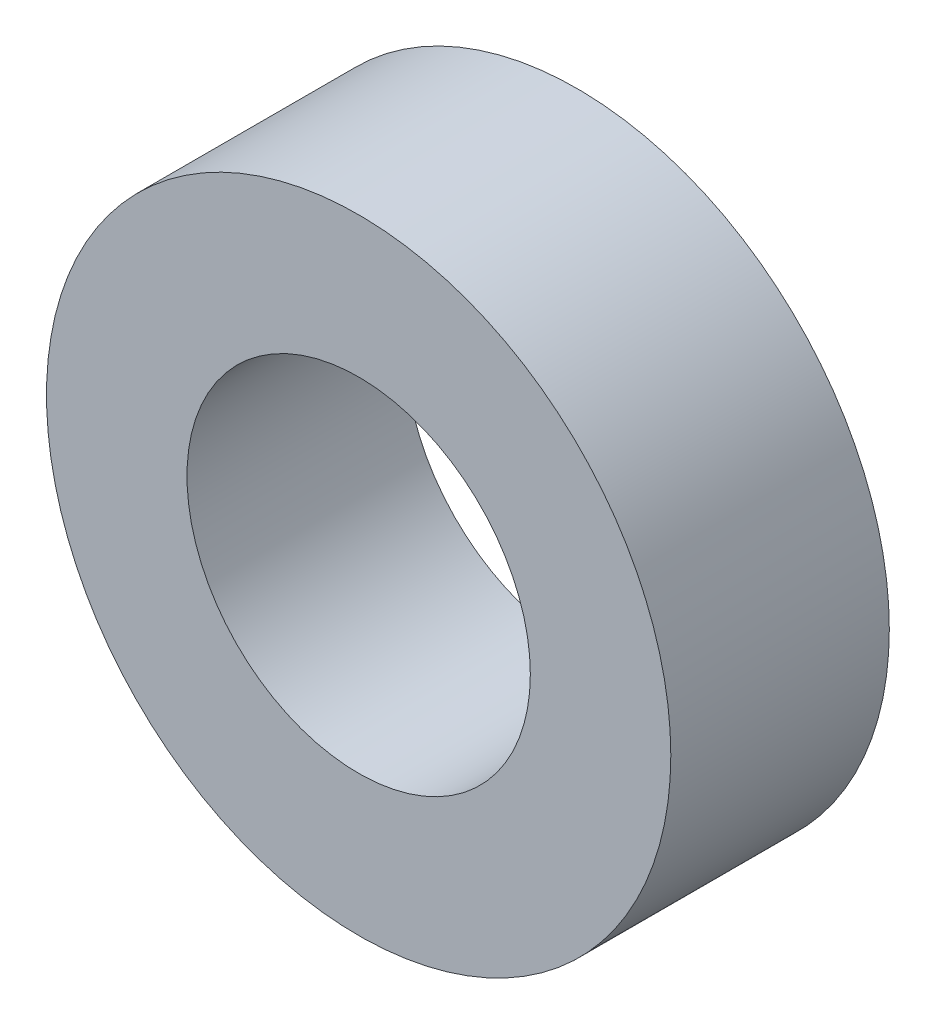
ISO-10303-21;
HEADER;
FILE_DESCRIPTION(('STEP AP214'),'2;1');
FILE_NAME('part.step','',(''),(''),'','','');
FILE_SCHEMA(('AUTOMOTIVE_DESIGN { 1 0 10303 214 1 1 1 1 }'));
ENDSEC;
DATA;
#1=APPLICATION_CONTEXT('core data for automotive mechanical design processes');
#2=APPLICATION_PROTOCOL_DEFINITION('international standard','automotive_design',2000,#1);
#3=PRODUCT_CONTEXT('',#1,'mechanical');
#4=PRODUCT('Part','Part','',(#3));
#5=PRODUCT_RELATED_PRODUCT_CATEGORY('part','',(#4));
#6=PRODUCT_DEFINITION_FORMATION('','',#4);
#7=PRODUCT_DEFINITION_CONTEXT('part definition',#1,'design');
#8=PRODUCT_DEFINITION('design','',#6,#7);
#9=PRODUCT_DEFINITION_SHAPE('','',#8);
#10=(LENGTH_UNIT() NAMED_UNIT(*) SI_UNIT(.MILLI.,.METRE.));
#11=(NAMED_UNIT(*) PLANE_ANGLE_UNIT() SI_UNIT($,.RADIAN.));
#12=(NAMED_UNIT(*) SI_UNIT($,.STERADIAN.) SOLID_ANGLE_UNIT());
#13=UNCERTAINTY_MEASURE_WITH_UNIT(LENGTH_MEASURE(1.E-05),#10,'distance_accuracy_value','');
#14=(GEOMETRIC_REPRESENTATION_CONTEXT(3) GLOBAL_UNCERTAINTY_ASSIGNED_CONTEXT((#13)) GLOBAL_UNIT_ASSIGNED_CONTEXT((#10,
#11,#12)) REPRESENTATION_CONTEXT('',''));
#15=CARTESIAN_POINT('',(0.,0.,0.));
#16=DIRECTION('',(0.,0.,1.));
#17=DIRECTION('',(1.,0.,0.));
#18=AXIS2_PLACEMENT_3D('',#15,#16,#17);
#19=CARTESIAN_POINT('',(0.,0.,17.5));
#20=DIRECTION('',(0.,0.,1.));
#21=DIRECTION('',(1.,0.,0.));
#22=AXIS2_PLACEMENT_3D('',#19,#20,#21);
#23=PLANE('',#22);
#24=CARTESIAN_POINT('',(0.,0.,17.5));
#25=DIRECTION('',(0.,0.,1.));
#26=DIRECTION('',(1.,0.,0.));
#27=AXIS2_PLACEMENT_3D('',#24,#25,#26);
#28=CIRCLE('',#27,50.);
#29=CARTESIAN_POINT('',(50.,0.,17.5));
#30=VERTEX_POINT('',#29);
#31=EDGE_CURVE('E10',#30,#30,#28,.T.);
#32=ORIENTED_EDGE('',*,*,#31,.T.);
#33=EDGE_LOOP('',(#32));
#34=FACE_BOUND('',#33,.T.);
#35=CARTESIAN_POINT('',(0.,0.,17.5));
#36=DIRECTION('',(0.,0.,1.));
#37=DIRECTION('',(1.,0.,0.));
#38=AXIS2_PLACEMENT_3D('',#35,#36,#37);
#39=CIRCLE('',#38,27.5);
#40=CARTESIAN_POINT('',(27.5,0.,17.5));
#41=VERTEX_POINT('',#40);
#42=EDGE_CURVE('E52',#41,#41,#39,.T.);
#43=ORIENTED_EDGE('',*,*,#42,.F.);
#44=EDGE_LOOP('',(#43));
#45=FACE_BOUND('',#44,.T.);
#46=ADVANCED_FACE('F41',(#34,#45),#23,.T.);
#47=CARTESIAN_POINT('',(0.,0.,-17.5));
#48=DIRECTION('',(0.,0.,1.));
#49=DIRECTION('',(1.,0.,0.));
#50=AXIS2_PLACEMENT_3D('',#47,#48,#49);
#51=PLANE('',#50);
#52=CARTESIAN_POINT('',(0.,0.,-17.5));
#53=DIRECTION('',(0.,0.,1.));
#54=DIRECTION('',(1.,0.,0.));
#55=AXIS2_PLACEMENT_3D('',#52,#53,#54);
#56=CIRCLE('',#55,50.);
#57=CARTESIAN_POINT('',(50.,0.,-17.5));
#58=VERTEX_POINT('',#57);
#59=EDGE_CURVE('E45',#58,#58,#56,.T.);
#60=ORIENTED_EDGE('',*,*,#59,.F.);
#61=EDGE_LOOP('',(#60));
#62=FACE_BOUND('',#61,.T.);
#63=CARTESIAN_POINT('',(0.,0.,-17.5));
#64=DIRECTION('',(0.,0.,1.));
#65=DIRECTION('',(1.,0.,0.));
#66=AXIS2_PLACEMENT_3D('',#63,#64,#65);
#67=CIRCLE('',#66,27.5);
#68=CARTESIAN_POINT('',(27.5,0.,-17.5));
#69=VERTEX_POINT('',#68);
#70=EDGE_CURVE('E54',#69,#69,#67,.T.);
#71=ORIENTED_EDGE('',*,*,#70,.T.);
#72=EDGE_LOOP('',(#71));
#73=FACE_BOUND('',#72,.T.);
#74=ADVANCED_FACE('F64',(#62,#73),#51,.F.);
#75=CARTESIAN_POINT('',(0.,0.,17.5));
#76=DIRECTION('',(0.,0.,-1.));
#77=DIRECTION('',(-1.,0.,0.));
#78=AXIS2_PLACEMENT_3D('',#75,#76,#77);
#79=CYLINDRICAL_SURFACE('',#78,50.);
#80=ORIENTED_EDGE('',*,*,#31,.F.);
#81=EDGE_LOOP('',(#80));
#82=FACE_BOUND('',#81,.T.);
#83=ORIENTED_EDGE('',*,*,#59,.T.);
#84=EDGE_LOOP('',(#83));
#85=FACE_BOUND('',#84,.T.);
#86=ADVANCED_FACE('F43',(#82,#85),#79,.T.);
#87=CARTESIAN_POINT('',(0.,0.,17.5));
#88=DIRECTION('',(0.,0.,-1.));
#89=DIRECTION('',(-1.,0.,0.));
#90=AXIS2_PLACEMENT_3D('',#87,#88,#89);
#91=CYLINDRICAL_SURFACE('',#90,27.5);
#92=ORIENTED_EDGE('',*,*,#42,.T.);
#93=EDGE_LOOP('',(#92));
#94=FACE_BOUND('',#93,.T.);
#95=ORIENTED_EDGE('',*,*,#70,.F.);
#96=EDGE_LOOP('',(#95));
#97=FACE_BOUND('',#96,.T.);
#98=ADVANCED_FACE('F60',(#94,#97),#91,.F.);
#99=CLOSED_SHELL('',(#46,#74,#86,#98));
#100=MANIFOLD_SOLID_BREP('B2',#99);
#101=ADVANCED_BREP_SHAPE_REPRESENTATION('',(#18,#100),#14);
#102=SHAPE_DEFINITION_REPRESENTATION(#9,#101);
ENDSEC;
END-ISO-10303-21;
